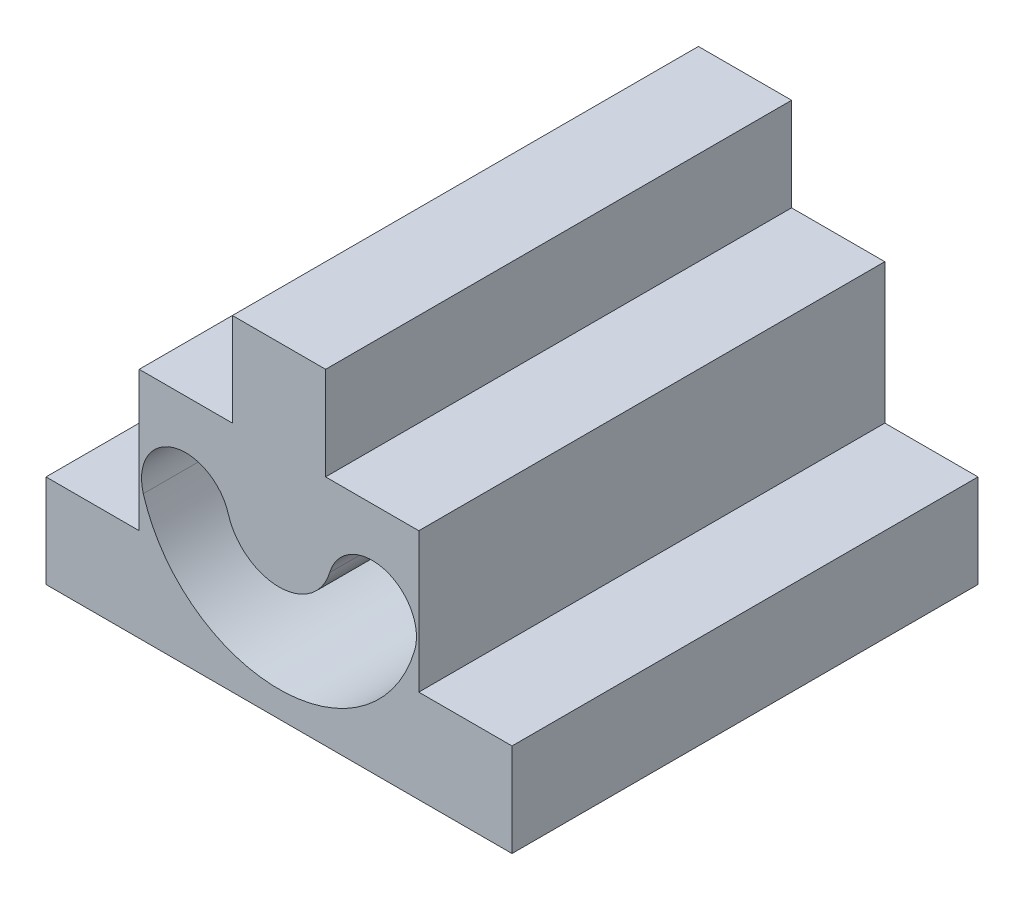
ISO-10303-21;
HEADER;
FILE_DESCRIPTION(('STEP AP214'),'2;1');
FILE_NAME('part.step','',(''),(''),'','','');
FILE_SCHEMA(('AUTOMOTIVE_DESIGN { 1 0 10303 214 1 1 1 1 }'));
ENDSEC;
DATA;
#1=APPLICATION_CONTEXT('core data for automotive mechanical design processes');
#2=APPLICATION_PROTOCOL_DEFINITION('international standard','automotive_design',2000,#1);
#3=PRODUCT_CONTEXT('',#1,'mechanical');
#4=PRODUCT('Part','Part','',(#3));
#5=PRODUCT_RELATED_PRODUCT_CATEGORY('part','',(#4));
#6=PRODUCT_DEFINITION_FORMATION('','',#4);
#7=PRODUCT_DEFINITION_CONTEXT('part definition',#1,'design');
#8=PRODUCT_DEFINITION('design','',#6,#7);
#9=PRODUCT_DEFINITION_SHAPE('','',#8);
#10=(LENGTH_UNIT() NAMED_UNIT(*) SI_UNIT(.MILLI.,.METRE.));
#11=(NAMED_UNIT(*) PLANE_ANGLE_UNIT() SI_UNIT($,.RADIAN.));
#12=(NAMED_UNIT(*) SI_UNIT($,.STERADIAN.) SOLID_ANGLE_UNIT());
#13=UNCERTAINTY_MEASURE_WITH_UNIT(LENGTH_MEASURE(1.E-05),#10,'distance_accuracy_value','');
#14=(GEOMETRIC_REPRESENTATION_CONTEXT(3) GLOBAL_UNCERTAINTY_ASSIGNED_CONTEXT((#13)) GLOBAL_UNIT_ASSIGNED_CONTEXT((#10,
#11,#12)) REPRESENTATION_CONTEXT('',''));
#15=CARTESIAN_POINT('',(0.,0.,0.));
#16=DIRECTION('',(0.,0.,1.));
#17=DIRECTION('',(1.,0.,0.));
#18=AXIS2_PLACEMENT_3D('',#15,#16,#17);
#19=CARTESIAN_POINT('',(-5.,0.,5.));
#20=DIRECTION('',(1.,0.,0.));
#21=DIRECTION('',(0.,0.,-1.));
#22=AXIS2_PLACEMENT_3D('',#19,#20,#21);
#23=PLANE('',#22);
#24=DIRECTION('',(0.,-1.,0.));
#25=VECTOR('',#24,1.);
#26=CARTESIAN_POINT('',(-5.,0.,-5.));
#27=LINE('',#26,#25);
#28=CARTESIAN_POINT('',(-5.,2.,-5.));
#29=VERTEX_POINT('',#28);
#30=CARTESIAN_POINT('',(-5.,0.,-5.));
#31=VERTEX_POINT('',#30);
#32=EDGE_CURVE('E198',#29,#31,#27,.T.);
#33=ORIENTED_EDGE('',*,*,#32,.T.);
#34=DIRECTION('',(0.,0.,-1.));
#35=VECTOR('',#34,1.);
#36=CARTESIAN_POINT('',(-5.,0.,5.));
#37=LINE('',#36,#35);
#38=CARTESIAN_POINT('',(-5.,0.,5.));
#39=VERTEX_POINT('',#38);
#40=EDGE_CURVE('E11',#39,#31,#37,.T.);
#41=ORIENTED_EDGE('',*,*,#40,.F.);
#42=DIRECTION('',(0.,-1.,0.));
#43=VECTOR('',#42,1.);
#44=CARTESIAN_POINT('',(-5.,0.,5.));
#45=LINE('',#44,#43);
#46=CARTESIAN_POINT('',(-5.,2.,5.));
#47=VERTEX_POINT('',#46);
#48=EDGE_CURVE('E204',#47,#39,#45,.T.);
#49=ORIENTED_EDGE('',*,*,#48,.F.);
#50=DIRECTION('',(0.,0.,-1.));
#51=VECTOR('',#50,1.);
#52=CARTESIAN_POINT('',(-5.,2.,5.));
#53=LINE('',#52,#51);
#54=EDGE_CURVE('E242',#47,#29,#53,.T.);
#55=ORIENTED_EDGE('',*,*,#54,.T.);
#56=EDGE_LOOP('',(#33,#41,#49,#55));
#57=FACE_BOUND('',#56,.T.);
#58=ADVANCED_FACE('F42',(#57),#23,.F.);
#59=CARTESIAN_POINT('',(-5.,0.,5.));
#60=DIRECTION('',(0.,1.,0.));
#61=DIRECTION('',(-1.,0.,0.));
#62=AXIS2_PLACEMENT_3D('',#59,#60,#61);
#63=PLANE('',#62);
#64=DIRECTION('',(1.,0.,0.));
#65=VECTOR('',#64,1.);
#66=CARTESIAN_POINT('',(-5.,0.,-5.));
#67=LINE('',#66,#65);
#68=CARTESIAN_POINT('',(5.,0.,-5.));
#69=VERTEX_POINT('',#68);
#70=EDGE_CURVE('E246',#31,#69,#67,.T.);
#71=ORIENTED_EDGE('',*,*,#70,.T.);
#72=DIRECTION('',(0.,0.,-1.));
#73=VECTOR('',#72,1.);
#74=CARTESIAN_POINT('',(5.,0.,5.));
#75=LINE('',#74,#73);
#76=CARTESIAN_POINT('',(5.,0.,5.));
#77=VERTEX_POINT('',#76);
#78=EDGE_CURVE('E50',#77,#69,#75,.T.);
#79=ORIENTED_EDGE('',*,*,#78,.F.);
#80=DIRECTION('',(1.,0.,0.));
#81=VECTOR('',#80,1.);
#82=CARTESIAN_POINT('',(-5.,0.,5.));
#83=LINE('',#82,#81);
#84=EDGE_CURVE('E208',#39,#77,#83,.T.);
#85=ORIENTED_EDGE('',*,*,#84,.F.);
#86=ORIENTED_EDGE('',*,*,#40,.T.);
#87=EDGE_LOOP('',(#71,#79,#85,#86));
#88=FACE_BOUND('',#87,.T.);
#89=ADVANCED_FACE('F343',(#88),#63,.F.);
#90=CARTESIAN_POINT('',(5.,0.,5.));
#91=DIRECTION('',(-1.,0.,0.));
#92=DIRECTION('',(0.,0.,1.));
#93=AXIS2_PLACEMENT_3D('',#90,#91,#92);
#94=PLANE('',#93);
#95=DIRECTION('',(0.,1.,0.));
#96=VECTOR('',#95,1.);
#97=CARTESIAN_POINT('',(5.,0.,-5.));
#98=LINE('',#97,#96);
#99=CARTESIAN_POINT('',(5.,2.,-5.));
#100=VERTEX_POINT('',#99);
#101=EDGE_CURVE('E249',#69,#100,#98,.T.);
#102=ORIENTED_EDGE('',*,*,#101,.T.);
#103=DIRECTION('',(0.,0.,-1.));
#104=VECTOR('',#103,1.);
#105=CARTESIAN_POINT('',(5.,2.,5.));
#106=LINE('',#105,#104);
#107=CARTESIAN_POINT('',(5.,2.,5.));
#108=VERTEX_POINT('',#107);
#109=EDGE_CURVE('E313',#108,#100,#106,.T.);
#110=ORIENTED_EDGE('',*,*,#109,.F.);
#111=DIRECTION('',(0.,1.,0.));
#112=VECTOR('',#111,1.);
#113=CARTESIAN_POINT('',(5.,0.,5.));
#114=LINE('',#113,#112);
#115=EDGE_CURVE('E212',#77,#108,#114,.T.);
#116=ORIENTED_EDGE('',*,*,#115,.F.);
#117=ORIENTED_EDGE('',*,*,#78,.T.);
#118=EDGE_LOOP('',(#102,#110,#116,#117));
#119=FACE_BOUND('',#118,.T.);
#120=ADVANCED_FACE('F322',(#119),#94,.F.);
#121=CARTESIAN_POINT('',(5.,2.,5.));
#122=DIRECTION('',(0.,-1.,0.));
#123=DIRECTION('',(0.,0.,-1.));
#124=AXIS2_PLACEMENT_3D('',#121,#122,#123);
#125=PLANE('',#124);
#126=DIRECTION('',(-1.,0.,0.));
#127=VECTOR('',#126,1.);
#128=CARTESIAN_POINT('',(5.,2.,-5.));
#129=LINE('',#128,#127);
#130=CARTESIAN_POINT('',(3.,2.,-5.));
#131=VERTEX_POINT('',#130);
#132=EDGE_CURVE('E252',#100,#131,#129,.T.);
#133=ORIENTED_EDGE('',*,*,#132,.T.);
#134=DIRECTION('',(0.,0.,-1.));
#135=VECTOR('',#134,1.);
#136=CARTESIAN_POINT('',(3.,2.,5.));
#137=LINE('',#136,#135);
#138=CARTESIAN_POINT('',(3.,2.,5.));
#139=VERTEX_POINT('',#138);
#140=EDGE_CURVE('E309',#139,#131,#137,.T.);
#141=ORIENTED_EDGE('',*,*,#140,.F.);
#142=DIRECTION('',(-1.,0.,0.));
#143=VECTOR('',#142,1.);
#144=CARTESIAN_POINT('',(5.,2.,5.));
#145=LINE('',#144,#143);
#146=EDGE_CURVE('E215',#108,#139,#145,.T.);
#147=ORIENTED_EDGE('',*,*,#146,.F.);
#148=ORIENTED_EDGE('',*,*,#109,.T.);
#149=EDGE_LOOP('',(#133,#141,#147,#148));
#150=FACE_BOUND('',#149,.T.);
#151=ADVANCED_FACE('F331',(#150),#125,.F.);
#152=CARTESIAN_POINT('',(3.,2.,5.));
#153=DIRECTION('',(-1.,0.,0.));
#154=DIRECTION('',(0.,0.,1.));
#155=AXIS2_PLACEMENT_3D('',#152,#153,#154);
#156=PLANE('',#155);
#157=DIRECTION('',(0.,1.,0.));
#158=VECTOR('',#157,1.);
#159=CARTESIAN_POINT('',(3.,2.,-5.));
#160=LINE('',#159,#158);
#161=CARTESIAN_POINT('',(3.,5.,-5.));
#162=VERTEX_POINT('',#161);
#163=EDGE_CURVE('E255',#131,#162,#160,.T.);
#164=ORIENTED_EDGE('',*,*,#163,.T.);
#165=DIRECTION('',(0.,0.,-1.));
#166=VECTOR('',#165,1.);
#167=CARTESIAN_POINT('',(3.,5.,5.));
#168=LINE('',#167,#166);
#169=CARTESIAN_POINT('',(3.,5.,5.));
#170=VERTEX_POINT('',#169);
#171=EDGE_CURVE('E305',#170,#162,#168,.T.);
#172=ORIENTED_EDGE('',*,*,#171,.F.);
#173=DIRECTION('',(0.,1.,0.));
#174=VECTOR('',#173,1.);
#175=CARTESIAN_POINT('',(3.,2.,5.));
#176=LINE('',#175,#174);
#177=EDGE_CURVE('E218',#139,#170,#176,.T.);
#178=ORIENTED_EDGE('',*,*,#177,.F.);
#179=ORIENTED_EDGE('',*,*,#140,.T.);
#180=EDGE_LOOP('',(#164,#172,#178,#179));
#181=FACE_BOUND('',#180,.T.);
#182=ADVANCED_FACE('F335',(#181),#156,.F.);
#183=CARTESIAN_POINT('',(3.,5.,5.));
#184=DIRECTION('',(0.,-1.,0.));
#185=DIRECTION('',(0.,0.,-1.));
#186=AXIS2_PLACEMENT_3D('',#183,#184,#185);
#187=PLANE('',#186);
#188=DIRECTION('',(-1.,0.,0.));
#189=VECTOR('',#188,1.);
#190=CARTESIAN_POINT('',(3.,5.,-5.));
#191=LINE('',#190,#189);
#192=CARTESIAN_POINT('',(1.,5.,-5.));
#193=VERTEX_POINT('',#192);
#194=EDGE_CURVE('E258',#162,#193,#191,.T.);
#195=ORIENTED_EDGE('',*,*,#194,.T.);
#196=DIRECTION('',(0.,0.,-1.));
#197=VECTOR('',#196,1.);
#198=CARTESIAN_POINT('',(1.,5.,5.));
#199=LINE('',#198,#197);
#200=CARTESIAN_POINT('',(1.,5.,5.));
#201=VERTEX_POINT('',#200);
#202=EDGE_CURVE('E301',#201,#193,#199,.T.);
#203=ORIENTED_EDGE('',*,*,#202,.F.);
#204=DIRECTION('',(-1.,0.,0.));
#205=VECTOR('',#204,1.);
#206=CARTESIAN_POINT('',(3.,5.,5.));
#207=LINE('',#206,#205);
#208=EDGE_CURVE('E221',#170,#201,#207,.T.);
#209=ORIENTED_EDGE('',*,*,#208,.F.);
#210=ORIENTED_EDGE('',*,*,#171,.T.);
#211=EDGE_LOOP('',(#195,#203,#209,#210));
#212=FACE_BOUND('',#211,.T.);
#213=ADVANCED_FACE('F376',(#212),#187,.F.);
#214=CARTESIAN_POINT('',(1.,5.,5.));
#215=DIRECTION('',(-1.,0.,0.));
#216=DIRECTION('',(0.,0.,1.));
#217=AXIS2_PLACEMENT_3D('',#214,#215,#216);
#218=PLANE('',#217);
#219=DIRECTION('',(0.,1.,0.));
#220=VECTOR('',#219,1.);
#221=CARTESIAN_POINT('',(1.,5.,-5.));
#222=LINE('',#221,#220);
#223=CARTESIAN_POINT('',(1.,7.,-5.));
#224=VERTEX_POINT('',#223);
#225=EDGE_CURVE('E261',#193,#224,#222,.T.);
#226=ORIENTED_EDGE('',*,*,#225,.T.);
#227=DIRECTION('',(0.,0.,-1.));
#228=VECTOR('',#227,1.);
#229=CARTESIAN_POINT('',(1.,7.,5.));
#230=LINE('',#229,#228);
#231=CARTESIAN_POINT('',(1.,7.,5.));
#232=VERTEX_POINT('',#231);
#233=EDGE_CURVE('E297',#232,#224,#230,.T.);
#234=ORIENTED_EDGE('',*,*,#233,.F.);
#235=DIRECTION('',(0.,1.,0.));
#236=VECTOR('',#235,1.);
#237=CARTESIAN_POINT('',(1.,5.,5.));
#238=LINE('',#237,#236);
#239=EDGE_CURVE('E224',#201,#232,#238,.T.);
#240=ORIENTED_EDGE('',*,*,#239,.F.);
#241=ORIENTED_EDGE('',*,*,#202,.T.);
#242=EDGE_LOOP('',(#226,#234,#240,#241));
#243=FACE_BOUND('',#242,.T.);
#244=ADVANCED_FACE('F374',(#243),#218,.F.);
#245=CARTESIAN_POINT('',(-1.,7.,5.));
#246=DIRECTION('',(0.,-1.,0.));
#247=DIRECTION('',(0.,0.,-1.));
#248=AXIS2_PLACEMENT_3D('',#245,#246,#247);
#249=PLANE('',#248);
#250=DIRECTION('',(-1.,0.,0.));
#251=VECTOR('',#250,1.);
#252=CARTESIAN_POINT('',(-1.,7.,-5.));
#253=LINE('',#252,#251);
#254=CARTESIAN_POINT('',(-1.,7.,-5.));
#255=VERTEX_POINT('',#254);
#256=EDGE_CURVE('E264',#224,#255,#253,.T.);
#257=ORIENTED_EDGE('',*,*,#256,.T.);
#258=DIRECTION('',(0.,0.,-1.));
#259=VECTOR('',#258,1.);
#260=CARTESIAN_POINT('',(-1.,7.,5.));
#261=LINE('',#260,#259);
#262=CARTESIAN_POINT('',(-1.,7.,5.));
#263=VERTEX_POINT('',#262);
#264=EDGE_CURVE('E293',#263,#255,#261,.T.);
#265=ORIENTED_EDGE('',*,*,#264,.F.);
#266=DIRECTION('',(-1.,0.,0.));
#267=VECTOR('',#266,1.);
#268=CARTESIAN_POINT('',(-1.,7.,5.));
#269=LINE('',#268,#267);
#270=EDGE_CURVE('E227',#232,#263,#269,.T.);
#271=ORIENTED_EDGE('',*,*,#270,.F.);
#272=ORIENTED_EDGE('',*,*,#233,.T.);
#273=EDGE_LOOP('',(#257,#265,#271,#272));
#274=FACE_BOUND('',#273,.T.);
#275=ADVANCED_FACE('F370',(#274),#249,.F.);
#276=CARTESIAN_POINT('',(-1.,5.,5.));
#277=DIRECTION('',(1.,0.,0.));
#278=DIRECTION('',(0.,0.,-1.));
#279=AXIS2_PLACEMENT_3D('',#276,#277,#278);
#280=PLANE('',#279);
#281=DIRECTION('',(0.,-1.,0.));
#282=VECTOR('',#281,1.);
#283=CARTESIAN_POINT('',(-1.,5.,-5.));
#284=LINE('',#283,#282);
#285=CARTESIAN_POINT('',(-1.,5.,-5.));
#286=VERTEX_POINT('',#285);
#287=EDGE_CURVE('E267',#255,#286,#284,.T.);
#288=ORIENTED_EDGE('',*,*,#287,.T.);
#289=DIRECTION('',(0.,0.,-1.));
#290=VECTOR('',#289,1.);
#291=CARTESIAN_POINT('',(-1.,5.,5.));
#292=LINE('',#291,#290);
#293=CARTESIAN_POINT('',(-1.,5.,5.));
#294=VERTEX_POINT('',#293);
#295=EDGE_CURVE('E289',#294,#286,#292,.T.);
#296=ORIENTED_EDGE('',*,*,#295,.F.);
#297=DIRECTION('',(0.,-1.,0.));
#298=VECTOR('',#297,1.);
#299=CARTESIAN_POINT('',(-1.,5.,5.));
#300=LINE('',#299,#298);
#301=EDGE_CURVE('E230',#263,#294,#300,.T.);
#302=ORIENTED_EDGE('',*,*,#301,.F.);
#303=ORIENTED_EDGE('',*,*,#264,.T.);
#304=EDGE_LOOP('',(#288,#296,#302,#303));
#305=FACE_BOUND('',#304,.T.);
#306=ADVANCED_FACE('F365',(#305),#280,.F.);
#307=CARTESIAN_POINT('',(-3.,5.,5.));
#308=DIRECTION('',(0.,-1.,0.));
#309=DIRECTION('',(0.,0.,-1.));
#310=AXIS2_PLACEMENT_3D('',#307,#308,#309);
#311=PLANE('',#310);
#312=DIRECTION('',(-1.,0.,0.));
#313=VECTOR('',#312,1.);
#314=CARTESIAN_POINT('',(-3.,5.,-5.));
#315=LINE('',#314,#313);
#316=CARTESIAN_POINT('',(-3.,5.,-5.));
#317=VERTEX_POINT('',#316);
#318=EDGE_CURVE('E270',#286,#317,#315,.T.);
#319=ORIENTED_EDGE('',*,*,#318,.T.);
#320=DIRECTION('',(0.,0.,-1.));
#321=VECTOR('',#320,1.);
#322=CARTESIAN_POINT('',(-3.,5.,5.));
#323=LINE('',#322,#321);
#324=CARTESIAN_POINT('',(-3.,5.,5.));
#325=VERTEX_POINT('',#324);
#326=EDGE_CURVE('E285',#325,#317,#323,.T.);
#327=ORIENTED_EDGE('',*,*,#326,.F.);
#328=DIRECTION('',(-1.,0.,0.));
#329=VECTOR('',#328,1.);
#330=CARTESIAN_POINT('',(-3.,5.,5.));
#331=LINE('',#330,#329);
#332=EDGE_CURVE('E233',#294,#325,#331,.T.);
#333=ORIENTED_EDGE('',*,*,#332,.F.);
#334=ORIENTED_EDGE('',*,*,#295,.T.);
#335=EDGE_LOOP('',(#319,#327,#333,#334));
#336=FACE_BOUND('',#335,.T.);
#337=ADVANCED_FACE('F359',(#336),#311,.F.);
#338=CARTESIAN_POINT('',(-3.,2.,5.));
#339=DIRECTION('',(1.,0.,0.));
#340=DIRECTION('',(0.,0.,-1.));
#341=AXIS2_PLACEMENT_3D('',#338,#339,#340);
#342=PLANE('',#341);
#343=DIRECTION('',(0.,-1.,0.));
#344=VECTOR('',#343,1.);
#345=CARTESIAN_POINT('',(-3.,2.,-5.));
#346=LINE('',#345,#344);
#347=CARTESIAN_POINT('',(-3.,2.,-5.));
#348=VERTEX_POINT('',#347);
#349=EDGE_CURVE('E273',#317,#348,#346,.T.);
#350=ORIENTED_EDGE('',*,*,#349,.T.);
#351=DIRECTION('',(0.,0.,-1.));
#352=VECTOR('',#351,1.);
#353=CARTESIAN_POINT('',(-3.,2.,5.));
#354=LINE('',#353,#352);
#355=CARTESIAN_POINT('',(-3.,2.,5.));
#356=VERTEX_POINT('',#355);
#357=EDGE_CURVE('E281',#356,#348,#354,.T.);
#358=ORIENTED_EDGE('',*,*,#357,.F.);
#359=DIRECTION('',(0.,-1.,0.));
#360=VECTOR('',#359,1.);
#361=CARTESIAN_POINT('',(-3.,2.,5.));
#362=LINE('',#361,#360);
#363=EDGE_CURVE('E236',#325,#356,#362,.T.);
#364=ORIENTED_EDGE('',*,*,#363,.F.);
#365=ORIENTED_EDGE('',*,*,#326,.T.);
#366=EDGE_LOOP('',(#350,#358,#364,#365));
#367=FACE_BOUND('',#366,.T.);
#368=ADVANCED_FACE('F355',(#367),#342,.F.);
#369=CARTESIAN_POINT('',(-5.,2.,5.));
#370=DIRECTION('',(0.,-1.,0.));
#371=DIRECTION('',(0.,0.,-1.));
#372=AXIS2_PLACEMENT_3D('',#369,#370,#371);
#373=PLANE('',#372);
#374=DIRECTION('',(-1.,0.,0.));
#375=VECTOR('',#374,1.);
#376=CARTESIAN_POINT('',(-5.,2.,-5.));
#377=LINE('',#376,#375);
#378=EDGE_CURVE('E209',#348,#29,#377,.T.);
#379=ORIENTED_EDGE('',*,*,#378,.T.);
#380=ORIENTED_EDGE('',*,*,#54,.F.);
#381=DIRECTION('',(-1.,0.,0.));
#382=VECTOR('',#381,1.);
#383=CARTESIAN_POINT('',(-5.,2.,5.));
#384=LINE('',#383,#382);
#385=EDGE_CURVE('E239',#356,#47,#384,.T.);
#386=ORIENTED_EDGE('',*,*,#385,.F.);
#387=ORIENTED_EDGE('',*,*,#357,.T.);
#388=EDGE_LOOP('',(#379,#380,#386,#387));
#389=FACE_BOUND('',#388,.T.);
#390=ADVANCED_FACE('F350',(#389),#373,.F.);
#391=CARTESIAN_POINT('',(0.,0.,5.));
#392=DIRECTION('',(0.,0.,-1.));
#393=DIRECTION('',(-1.,0.,0.));
#394=AXIS2_PLACEMENT_3D('',#391,#392,#393);
#395=PLANE('',#394);
#396=CARTESIAN_POINT('',(0.,3.58844502730156,5.));
#397=DIRECTION('',(0.,0.,1.));
#398=DIRECTION('',(1.,0.,0.));
#399=AXIS2_PLACEMENT_3D('',#396,#397,#398);
#400=CIRCLE('',#399,3.03477038307722);
#401=CARTESIAN_POINT('',(-2.91137135073624,2.73185403031708,5.));
#402=VERTEX_POINT('',#401);
#403=CARTESIAN_POINT('',(2.91137135073624,2.73185403031708,5.));
#404=VERTEX_POINT('',#403);
#405=EDGE_CURVE('E189',#402,#404,#400,.T.);
#406=ORIENTED_EDGE('',*,*,#405,.F.);
#407=CARTESIAN_POINT('',(-2.,3.,5.));
#408=DIRECTION('',(0.,0.,1.));
#409=DIRECTION('',(1.,0.,0.));
#410=AXIS2_PLACEMENT_3D('',#407,#408,#409);
#411=CIRCLE('',#410,0.949999999999999);
#412=CARTESIAN_POINT('',(-1.08862864926376,3.26814596968293,5.));
#413=VERTEX_POINT('',#412);
#414=EDGE_CURVE('E57',#413,#402,#411,.T.);
#415=ORIENTED_EDGE('',*,*,#414,.F.);
#416=CARTESIAN_POINT('',(0.,3.58844502730156,5.));
#417=DIRECTION('',(0.,0.,-1.));
#418=DIRECTION('',(1.,0.,0.));
#419=AXIS2_PLACEMENT_3D('',#416,#417,#418);
#420=CIRCLE('',#419,1.13477038307722);
#421=CARTESIAN_POINT('',(1.08862864926376,3.26814596968293,5.));
#422=VERTEX_POINT('',#421);
#423=EDGE_CURVE('E176',#422,#413,#420,.T.);
#424=ORIENTED_EDGE('',*,*,#423,.F.);
#425=CARTESIAN_POINT('',(2.,3.,5.));
#426=DIRECTION('',(0.,0.,1.));
#427=DIRECTION('',(1.,0.,0.));
#428=AXIS2_PLACEMENT_3D('',#425,#426,#427);
#429=CIRCLE('',#428,0.949999999999999);
#430=EDGE_CURVE('E180',#404,#422,#429,.T.);
#431=ORIENTED_EDGE('',*,*,#430,.F.);
#432=EDGE_LOOP('',(#406,#415,#424,#431));
#433=FACE_BOUND('',#432,.T.);
#434=ORIENTED_EDGE('',*,*,#48,.T.);
#435=ORIENTED_EDGE('',*,*,#84,.T.);
#436=ORIENTED_EDGE('',*,*,#115,.T.);
#437=ORIENTED_EDGE('',*,*,#146,.T.);
#438=ORIENTED_EDGE('',*,*,#177,.T.);
#439=ORIENTED_EDGE('',*,*,#208,.T.);
#440=ORIENTED_EDGE('',*,*,#239,.T.);
#441=ORIENTED_EDGE('',*,*,#270,.T.);
#442=ORIENTED_EDGE('',*,*,#301,.T.);
#443=ORIENTED_EDGE('',*,*,#332,.T.);
#444=ORIENTED_EDGE('',*,*,#363,.T.);
#445=ORIENTED_EDGE('',*,*,#385,.T.);
#446=EDGE_LOOP('',(#434,#435,#436,#437,#438,#439,#440,#441,#442,#443,#444,#445));
#447=FACE_BOUND('',#446,.T.);
#448=ADVANCED_FACE('F339',(#433,#447),#395,.F.);
#449=CARTESIAN_POINT('',(0.,0.,-5.));
#450=DIRECTION('',(0.,0.,-1.));
#451=DIRECTION('',(-1.,0.,0.));
#452=AXIS2_PLACEMENT_3D('',#449,#450,#451);
#453=PLANE('',#452);
#454=CARTESIAN_POINT('',(-2.,3.,-5.));
#455=DIRECTION('',(0.,0.,1.));
#456=DIRECTION('',(1.,0.,0.));
#457=AXIS2_PLACEMENT_3D('',#454,#455,#456);
#458=CIRCLE('',#457,0.949999999999999);
#459=CARTESIAN_POINT('',(-1.08862864926376,3.26814596968293,-5.));
#460=VERTEX_POINT('',#459);
#461=CARTESIAN_POINT('',(-2.91137135073624,2.73185403031708,-5.));
#462=VERTEX_POINT('',#461);
#463=EDGE_CURVE('E157',#460,#462,#458,.T.);
#464=ORIENTED_EDGE('',*,*,#463,.T.);
#465=CARTESIAN_POINT('',(0.,3.58844502730156,-5.));
#466=DIRECTION('',(0.,0.,1.));
#467=DIRECTION('',(1.,0.,0.));
#468=AXIS2_PLACEMENT_3D('',#465,#466,#467);
#469=CIRCLE('',#468,3.03477038307722);
#470=CARTESIAN_POINT('',(2.91137135073624,2.73185403031708,-5.));
#471=VERTEX_POINT('',#470);
#472=EDGE_CURVE('E167',#462,#471,#469,.T.);
#473=ORIENTED_EDGE('',*,*,#472,.T.);
#474=CARTESIAN_POINT('',(2.,3.,-5.));
#475=DIRECTION('',(0.,0.,1.));
#476=DIRECTION('',(1.,0.,0.));
#477=AXIS2_PLACEMENT_3D('',#474,#475,#476);
#478=CIRCLE('',#477,0.949999999999999);
#479=CARTESIAN_POINT('',(1.08862864926376,3.26814596968293,-5.));
#480=VERTEX_POINT('',#479);
#481=EDGE_CURVE('E65',#471,#480,#478,.T.);
#482=ORIENTED_EDGE('',*,*,#481,.T.);
#483=CARTESIAN_POINT('',(0.,3.58844502730156,-5.));
#484=DIRECTION('',(0.,0.,-1.));
#485=DIRECTION('',(1.,0.,0.));
#486=AXIS2_PLACEMENT_3D('',#483,#484,#485);
#487=CIRCLE('',#486,1.13477038307722);
#488=EDGE_CURVE('E164',#480,#460,#487,.T.);
#489=ORIENTED_EDGE('',*,*,#488,.T.);
#490=EDGE_LOOP('',(#464,#473,#482,#489));
#491=FACE_BOUND('',#490,.T.);
#492=ORIENTED_EDGE('',*,*,#32,.F.);
#493=ORIENTED_EDGE('',*,*,#378,.F.);
#494=ORIENTED_EDGE('',*,*,#349,.F.);
#495=ORIENTED_EDGE('',*,*,#318,.F.);
#496=ORIENTED_EDGE('',*,*,#287,.F.);
#497=ORIENTED_EDGE('',*,*,#256,.F.);
#498=ORIENTED_EDGE('',*,*,#225,.F.);
#499=ORIENTED_EDGE('',*,*,#194,.F.);
#500=ORIENTED_EDGE('',*,*,#163,.F.);
#501=ORIENTED_EDGE('',*,*,#132,.F.);
#502=ORIENTED_EDGE('',*,*,#101,.F.);
#503=ORIENTED_EDGE('',*,*,#70,.F.);
#504=EDGE_LOOP('',(#492,#493,#494,#495,#496,#497,#498,#499,#500,#501,#502,#503));
#505=FACE_BOUND('',#504,.T.);
#506=ADVANCED_FACE('F172',(#491,#505),#453,.T.);
#507=CARTESIAN_POINT('',(-2.,3.,-5.));
#508=DIRECTION('',(0.,0.,1.));
#509=DIRECTION('',(1.,0.,0.));
#510=AXIS2_PLACEMENT_3D('',#507,#508,#509);
#511=CYLINDRICAL_SURFACE('',#510,0.949999999999999);
#512=ORIENTED_EDGE('',*,*,#414,.T.);
#513=DIRECTION('',(0.,0.,1.));
#514=VECTOR('',#513,1.);
#515=CARTESIAN_POINT('',(-2.91137135073624,2.73185403031708,-5.));
#516=LINE('',#515,#514);
#517=EDGE_CURVE('E153',#462,#402,#516,.T.);
#518=ORIENTED_EDGE('',*,*,#517,.F.);
#519=ORIENTED_EDGE('',*,*,#463,.F.);
#520=DIRECTION('',(0.,0.,1.));
#521=VECTOR('',#520,1.);
#522=CARTESIAN_POINT('',(-1.08862864926376,3.26814596968293,-5.));
#523=LINE('',#522,#521);
#524=EDGE_CURVE('E195',#460,#413,#523,.T.);
#525=ORIENTED_EDGE('',*,*,#524,.T.);
#526=EDGE_LOOP('',(#512,#518,#519,#525));
#527=FACE_BOUND('',#526,.T.);
#528=ADVANCED_FACE('F155',(#527),#511,.F.);
#529=CARTESIAN_POINT('',(0.,3.58844502730156,-5.));
#530=DIRECTION('',(0.,0.,1.));
#531=DIRECTION('',(1.,0.,0.));
#532=AXIS2_PLACEMENT_3D('',#529,#530,#531);
#533=CYLINDRICAL_SURFACE('',#532,1.13477038307722);
#534=ORIENTED_EDGE('',*,*,#423,.T.);
#535=ORIENTED_EDGE('',*,*,#524,.F.);
#536=ORIENTED_EDGE('',*,*,#488,.F.);
#537=DIRECTION('',(0.,0.,1.));
#538=VECTOR('',#537,1.);
#539=CARTESIAN_POINT('',(1.08862864926376,3.26814596968293,-5.));
#540=LINE('',#539,#538);
#541=EDGE_CURVE('E199',#480,#422,#540,.T.);
#542=ORIENTED_EDGE('',*,*,#541,.T.);
#543=EDGE_LOOP('',(#534,#535,#536,#542));
#544=FACE_BOUND('',#543,.T.);
#545=ADVANCED_FACE('F483',(#544),#533,.T.);
#546=CARTESIAN_POINT('',(2.,3.,-5.));
#547=DIRECTION('',(0.,0.,1.));
#548=DIRECTION('',(1.,0.,0.));
#549=AXIS2_PLACEMENT_3D('',#546,#547,#548);
#550=CYLINDRICAL_SURFACE('',#549,0.949999999999999);
#551=ORIENTED_EDGE('',*,*,#430,.T.);
#552=ORIENTED_EDGE('',*,*,#541,.F.);
#553=ORIENTED_EDGE('',*,*,#481,.F.);
#554=DIRECTION('',(0.,0.,1.));
#555=VECTOR('',#554,1.);
#556=CARTESIAN_POINT('',(2.91137135073624,2.73185403031708,-5.));
#557=LINE('',#556,#555);
#558=EDGE_CURVE('E163',#471,#404,#557,.T.);
#559=ORIENTED_EDGE('',*,*,#558,.T.);
#560=EDGE_LOOP('',(#551,#552,#553,#559));
#561=FACE_BOUND('',#560,.T.);
#562=ADVANCED_FACE('F493',(#561),#550,.F.);
#563=CARTESIAN_POINT('',(0.,3.58844502730156,-5.));
#564=DIRECTION('',(0.,0.,1.));
#565=DIRECTION('',(1.,0.,0.));
#566=AXIS2_PLACEMENT_3D('',#563,#564,#565);
#567=CYLINDRICAL_SURFACE('',#566,3.03477038307722);
#568=ORIENTED_EDGE('',*,*,#405,.T.);
#569=ORIENTED_EDGE('',*,*,#558,.F.);
#570=ORIENTED_EDGE('',*,*,#472,.F.);
#571=ORIENTED_EDGE('',*,*,#517,.T.);
#572=EDGE_LOOP('',(#568,#569,#570,#571));
#573=FACE_BOUND('',#572,.T.);
#574=ADVANCED_FACE('F168',(#573),#567,.F.);
#575=CLOSED_SHELL('',(#58,#89,#120,#151,#182,#213,#244,#275,#306,#337,#368,#390,#448,#506,#528,
#545,#562,#574));
#576=MANIFOLD_SOLID_BREP('B2',#575);
#577=ADVANCED_BREP_SHAPE_REPRESENTATION('',(#18,#576),#14);
#578=SHAPE_DEFINITION_REPRESENTATION(#9,#577);
ENDSEC;
END-ISO-10303-21;
